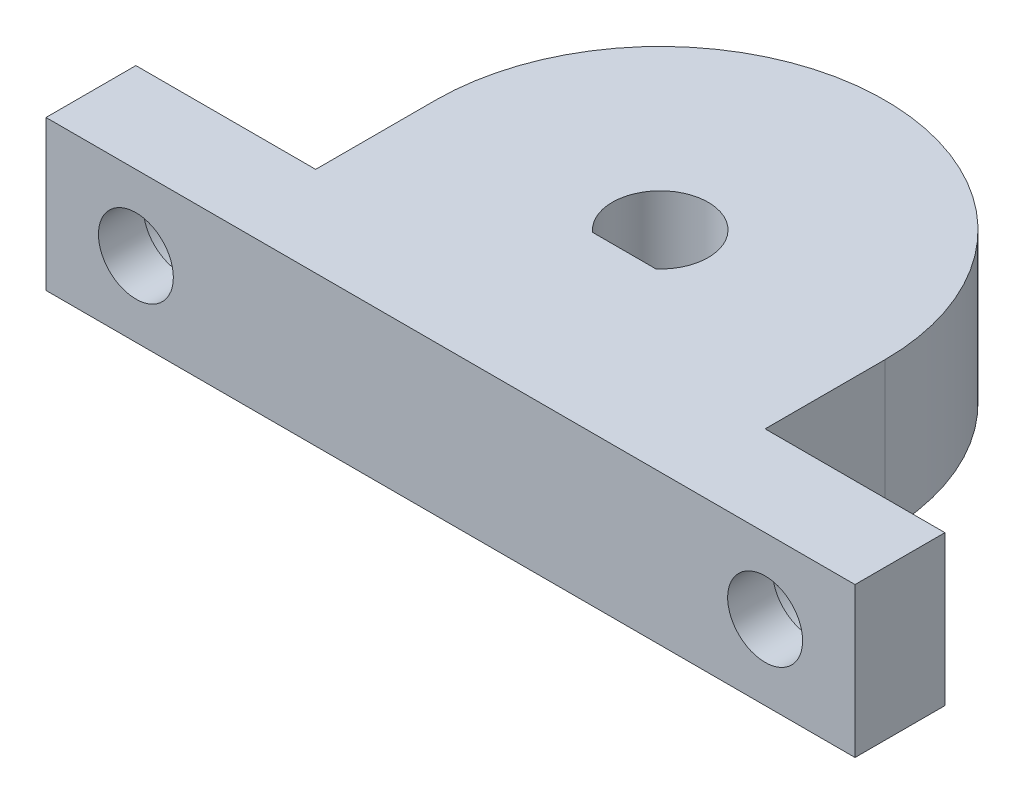
ISO-10303-21;
HEADER;
FILE_DESCRIPTION(('STEP AP214'),'2;1');
FILE_NAME('part.step','',(''),(''),'','','');
FILE_SCHEMA(('AUTOMOTIVE_DESIGN { 1 0 10303 214 1 1 1 1 }'));
ENDSEC;
DATA;
#1=APPLICATION_CONTEXT('core data for automotive mechanical design processes');
#2=APPLICATION_PROTOCOL_DEFINITION('international standard','automotive_design',2000,#1);
#3=PRODUCT_CONTEXT('',#1,'mechanical');
#4=PRODUCT('Part','Part','',(#3));
#5=PRODUCT_RELATED_PRODUCT_CATEGORY('part','',(#4));
#6=PRODUCT_DEFINITION_FORMATION('','',#4);
#7=PRODUCT_DEFINITION_CONTEXT('part definition',#1,'design');
#8=PRODUCT_DEFINITION('design','',#6,#7);
#9=PRODUCT_DEFINITION_SHAPE('','',#8);
#10=(LENGTH_UNIT() NAMED_UNIT(*) SI_UNIT(.MILLI.,.METRE.));
#11=(NAMED_UNIT(*) PLANE_ANGLE_UNIT() SI_UNIT($,.RADIAN.));
#12=(NAMED_UNIT(*) SI_UNIT($,.STERADIAN.) SOLID_ANGLE_UNIT());
#13=UNCERTAINTY_MEASURE_WITH_UNIT(LENGTH_MEASURE(1.E-05),#10,'distance_accuracy_value','');
#14=(GEOMETRIC_REPRESENTATION_CONTEXT(3) GLOBAL_UNCERTAINTY_ASSIGNED_CONTEXT((#13)) GLOBAL_UNIT_ASSIGNED_CONTEXT((#10,
#11,#12)) REPRESENTATION_CONTEXT('',''));
#15=CARTESIAN_POINT('',(0.,0.,0.));
#16=DIRECTION('',(0.,0.,1.));
#17=DIRECTION('',(1.,0.,0.));
#18=AXIS2_PLACEMENT_3D('',#15,#16,#17);
#19=CARTESIAN_POINT('',(152.500000000001,0.,0.));
#20=DIRECTION('',(-1.,0.,0.));
#21=DIRECTION('',(0.,0.,1.));
#22=AXIS2_PLACEMENT_3D('',#19,#20,#21);
#23=PLANE('',#22);
#24=DIRECTION('',(0.,0.,1.));
#25=VECTOR('',#24,1.);
#26=CARTESIAN_POINT('',(152.500000000001,0.,0.));
#27=LINE('',#26,#25);
#28=CARTESIAN_POINT('',(152.500000000001,0.,10.0000000000005));
#29=VERTEX_POINT('',#28);
#30=CARTESIAN_POINT('',(152.500000000001,0.,14.));
#31=VERTEX_POINT('',#30);
#32=EDGE_CURVE('E93',#29,#31,#27,.T.);
#33=ORIENTED_EDGE('',*,*,#32,.T.);
#34=DIRECTION('',(0.,1.,0.));
#35=VECTOR('',#34,1.);
#36=CARTESIAN_POINT('',(152.500000000001,0.,14.));
#37=LINE('',#36,#35);
#38=CARTESIAN_POINT('',(152.500000000001,5.,14.));
#39=VERTEX_POINT('',#38);
#40=EDGE_CURVE('E88',#31,#39,#37,.T.);
#41=ORIENTED_EDGE('',*,*,#40,.T.);
#42=DIRECTION('',(0.,0.,1.));
#43=VECTOR('',#42,1.);
#44=CARTESIAN_POINT('',(152.500000000001,5.,0.));
#45=LINE('',#44,#43);
#46=CARTESIAN_POINT('',(152.500000000001,5.,10.0000000000005));
#47=VERTEX_POINT('',#46);
#48=EDGE_CURVE('E207',#47,#39,#45,.T.);
#49=ORIENTED_EDGE('',*,*,#48,.F.);
#50=DIRECTION('',(0.,1.,0.));
#51=VECTOR('',#50,1.);
#52=CARTESIAN_POINT('',(152.500000000001,0.,10.0000000000005));
#53=LINE('',#52,#51);
#54=EDGE_CURVE('E203',#29,#47,#53,.T.);
#55=ORIENTED_EDGE('',*,*,#54,.F.);
#56=EDGE_LOOP('',(#33,#41,#49,#55));
#57=FACE_BOUND('',#56,.T.);
#58=ADVANCED_FACE('F71',(#57),#23,.T.);
#59=CARTESIAN_POINT('',(167.500000000001,0.,0.));
#60=DIRECTION('',(-1.,0.,0.));
#61=DIRECTION('',(0.,0.,1.));
#62=AXIS2_PLACEMENT_3D('',#59,#60,#61);
#63=PLANE('',#62);
#64=DIRECTION('',(0.,1.,0.));
#65=VECTOR('',#64,1.);
#66=CARTESIAN_POINT('',(167.500000000001,0.,14.));
#67=LINE('',#66,#65);
#68=CARTESIAN_POINT('',(167.500000000001,0.,14.));
#69=VERTEX_POINT('',#68);
#70=CARTESIAN_POINT('',(167.500000000001,5.,14.));
#71=VERTEX_POINT('',#70);
#72=EDGE_CURVE('E189',#69,#71,#67,.T.);
#73=ORIENTED_EDGE('',*,*,#72,.F.);
#74=DIRECTION('',(0.,0.,1.));
#75=VECTOR('',#74,1.);
#76=CARTESIAN_POINT('',(167.500000000001,0.,0.));
#77=LINE('',#76,#75);
#78=CARTESIAN_POINT('',(167.500000000001,0.,10.0000000000005));
#79=VERTEX_POINT('',#78);
#80=EDGE_CURVE('E200',#79,#69,#77,.T.);
#81=ORIENTED_EDGE('',*,*,#80,.F.);
#82=DIRECTION('',(0.,1.,0.));
#83=VECTOR('',#82,1.);
#84=CARTESIAN_POINT('',(167.500000000001,0.,10.0000000000005));
#85=LINE('',#84,#83);
#86=CARTESIAN_POINT('',(167.500000000001,5.,10.0000000000005));
#87=VERTEX_POINT('',#86);
#88=EDGE_CURVE('E204',#79,#87,#85,.T.);
#89=ORIENTED_EDGE('',*,*,#88,.T.);
#90=DIRECTION('',(0.,0.,1.));
#91=VECTOR('',#90,1.);
#92=CARTESIAN_POINT('',(167.500000000001,5.,0.));
#93=LINE('',#92,#91);
#94=EDGE_CURVE('E211',#87,#71,#93,.T.);
#95=ORIENTED_EDGE('',*,*,#94,.T.);
#96=EDGE_LOOP('',(#73,#81,#89,#95));
#97=FACE_BOUND('',#96,.T.);
#98=ADVANCED_FACE('F274',(#97),#63,.F.);
#99=CARTESIAN_POINT('',(160.,0.,10.));
#100=DIRECTION('',(0.,1.,0.));
#101=DIRECTION('',(0.,0.,1.));
#102=AXIS2_PLACEMENT_3D('',#99,#100,#101);
#103=CYLINDRICAL_SURFACE('',#102,1.59999999999999);
#104=CARTESIAN_POINT('',(160.,5.,10.));
#105=DIRECTION('',(0.,1.,0.));
#106=DIRECTION('',(0.,0.,1.));
#107=AXIS2_PLACEMENT_3D('',#104,#105,#106);
#108=CIRCLE('',#107,1.59999999999999);
#109=CARTESIAN_POINT('',(158.941699475574,5.,11.2));
#110=VERTEX_POINT('',#109);
#111=CARTESIAN_POINT('',(161.058300524426,5.,11.2));
#112=VERTEX_POINT('',#111);
#113=EDGE_CURVE('E80',#110,#112,#108,.F.);
#114=ORIENTED_EDGE('',*,*,#113,.F.);
#115=DIRECTION('',(0.,1.,0.));
#116=VECTOR('',#115,1.);
#117=CARTESIAN_POINT('',(158.941699475574,0.,11.2));
#118=LINE('',#117,#116);
#119=CARTESIAN_POINT('',(158.941699475574,0.,11.2));
#120=VERTEX_POINT('',#119);
#121=EDGE_CURVE('E225',#120,#110,#118,.T.);
#122=ORIENTED_EDGE('',*,*,#121,.F.);
#123=CARTESIAN_POINT('',(160.,0.,10.));
#124=DIRECTION('',(0.,1.,0.));
#125=DIRECTION('',(0.,0.,1.));
#126=AXIS2_PLACEMENT_3D('',#123,#124,#125);
#127=CIRCLE('',#126,1.59999999999999);
#128=CARTESIAN_POINT('',(161.058300524426,0.,11.2));
#129=VERTEX_POINT('',#128);
#130=EDGE_CURVE('E221',#129,#120,#127,.T.);
#131=ORIENTED_EDGE('',*,*,#130,.F.);
#132=DIRECTION('',(0.,1.,0.));
#133=VECTOR('',#132,1.);
#134=CARTESIAN_POINT('',(161.058300524426,0.,11.2));
#135=LINE('',#134,#133);
#136=EDGE_CURVE('E224',#129,#112,#135,.T.);
#137=ORIENTED_EDGE('',*,*,#136,.T.);
#138=EDGE_LOOP('',(#114,#122,#131,#137));
#139=FACE_BOUND('',#138,.T.);
#140=ADVANCED_FACE('F280',(#139),#103,.F.);
#141=CARTESIAN_POINT('',(0.,0.,11.2));
#142=DIRECTION('',(0.,0.,1.));
#143=DIRECTION('',(1.,0.,0.));
#144=AXIS2_PLACEMENT_3D('',#141,#142,#143);
#145=PLANE('',#144);
#146=DIRECTION('',(-1.,0.,0.));
#147=VECTOR('',#146,1.);
#148=CARTESIAN_POINT('',(0.,5.,11.2));
#149=LINE('',#148,#147);
#150=EDGE_CURVE('E216',#112,#110,#149,.T.);
#151=ORIENTED_EDGE('',*,*,#150,.F.);
#152=ORIENTED_EDGE('',*,*,#136,.F.);
#153=DIRECTION('',(1.,0.,0.));
#154=VECTOR('',#153,1.);
#155=CARTESIAN_POINT('',(0.,0.,11.2));
#156=LINE('',#155,#154);
#157=EDGE_CURVE('E218',#120,#129,#156,.T.);
#158=ORIENTED_EDGE('',*,*,#157,.F.);
#159=ORIENTED_EDGE('',*,*,#121,.T.);
#160=EDGE_LOOP('',(#151,#152,#158,#159));
#161=FACE_BOUND('',#160,.T.);
#162=ADVANCED_FACE('F289',(#161),#145,.F.);
#163=CARTESIAN_POINT('',(160.000000000001,0.,10.0000000000005));
#164=DIRECTION('',(0.,1.,0.));
#165=DIRECTION('',(0.,0.,1.));
#166=AXIS2_PLACEMENT_3D('',#163,#164,#165);
#167=CYLINDRICAL_SURFACE('',#166,7.50000000000001);
#168=ORIENTED_EDGE('',*,*,#88,.F.);
#169=CARTESIAN_POINT('',(160.000000000001,0.,10.0000000000005));
#170=DIRECTION('',(0.,1.,0.));
#171=DIRECTION('',(0.,0.,1.));
#172=AXIS2_PLACEMENT_3D('',#169,#170,#171);
#173=CIRCLE('',#172,7.50000000000001);
#174=EDGE_CURVE('E198',#79,#29,#173,.T.);
#175=ORIENTED_EDGE('',*,*,#174,.T.);
#176=ORIENTED_EDGE('',*,*,#54,.T.);
#177=CARTESIAN_POINT('',(160.000000000001,5.,10.0000000000005));
#178=DIRECTION('',(0.,1.,0.));
#179=DIRECTION('',(0.,0.,1.));
#180=AXIS2_PLACEMENT_3D('',#177,#178,#179);
#181=CIRCLE('',#180,7.50000000000001);
#182=EDGE_CURVE('E12',#87,#47,#181,.T.);
#183=ORIENTED_EDGE('',*,*,#182,.F.);
#184=EDGE_LOOP('',(#168,#175,#176,#183));
#185=FACE_BOUND('',#184,.T.);
#186=ADVANCED_FACE('F284',(#185),#167,.T.);
#187=CARTESIAN_POINT('',(140.,5.,0.));
#188=DIRECTION('',(0.,1.,0.));
#189=DIRECTION('',(0.,0.,1.));
#190=AXIS2_PLACEMENT_3D('',#187,#188,#189);
#191=PLANE('',#190);
#192=DIRECTION('',(1.,0.,0.));
#193=VECTOR('',#192,1.);
#194=CARTESIAN_POINT('',(140.,5.,17.));
#195=LINE('',#194,#193);
#196=CARTESIAN_POINT('',(146.500000000001,5.,17.));
#197=VERTEX_POINT('',#196);
#198=CARTESIAN_POINT('',(173.500000000001,5.,17.));
#199=VERTEX_POINT('',#198);
#200=EDGE_CURVE('E214',#197,#199,#195,.T.);
#201=ORIENTED_EDGE('',*,*,#200,.T.);
#202=DIRECTION('',(0.,0.,1.));
#203=VECTOR('',#202,1.);
#204=CARTESIAN_POINT('',(173.500000000001,5.,14.));
#205=LINE('',#204,#203);
#206=CARTESIAN_POINT('',(173.500000000001,5.,14.));
#207=VERTEX_POINT('',#206);
#208=EDGE_CURVE('E190',#207,#199,#205,.T.);
#209=ORIENTED_EDGE('',*,*,#208,.F.);
#210=DIRECTION('',(1.,0.,0.));
#211=VECTOR('',#210,1.);
#212=CARTESIAN_POINT('',(146.500000000001,5.,14.));
#213=LINE('',#212,#211);
#214=EDGE_CURVE('E185',#71,#207,#213,.T.);
#215=ORIENTED_EDGE('',*,*,#214,.F.);
#216=ORIENTED_EDGE('',*,*,#94,.F.);
#217=ORIENTED_EDGE('',*,*,#182,.T.);
#218=ORIENTED_EDGE('',*,*,#48,.T.);
#219=CARTESIAN_POINT('',(146.500000000001,5.,14.));
#220=VERTEX_POINT('',#219);
#221=EDGE_CURVE('E160',#220,#39,#213,.T.);
#222=ORIENTED_EDGE('',*,*,#221,.F.);
#223=DIRECTION('',(0.,0.,1.));
#224=VECTOR('',#223,1.);
#225=CARTESIAN_POINT('',(146.500000000001,5.,14.));
#226=LINE('',#225,#224);
#227=EDGE_CURVE('E172',#220,#197,#226,.T.);
#228=ORIENTED_EDGE('',*,*,#227,.T.);
#229=EDGE_LOOP('',(#201,#209,#215,#216,#217,#218,#222,#228));
#230=FACE_BOUND('',#229,.T.);
#231=ORIENTED_EDGE('',*,*,#150,.T.);
#232=ORIENTED_EDGE('',*,*,#113,.T.);
#233=EDGE_LOOP('',(#231,#232));
#234=FACE_BOUND('',#233,.T.);
#235=ADVANCED_FACE('F270',(#230,#234),#191,.T.);
#236=CARTESIAN_POINT('',(0.,0.,0.));
#237=DIRECTION('',(0.,1.,0.));
#238=DIRECTION('',(0.,0.,1.));
#239=AXIS2_PLACEMENT_3D('',#236,#237,#238);
#240=PLANE('',#239);
#241=DIRECTION('',(1.,0.,0.));
#242=VECTOR('',#241,1.);
#243=CARTESIAN_POINT('',(102.5,0.,17.));
#244=LINE('',#243,#242);
#245=CARTESIAN_POINT('',(146.500000000001,0.,17.));
#246=VERTEX_POINT('',#245);
#247=CARTESIAN_POINT('',(173.500000000001,0.,17.));
#248=VERTEX_POINT('',#247);
#249=EDGE_CURVE('E154',#246,#248,#244,.T.);
#250=ORIENTED_EDGE('',*,*,#249,.F.);
#251=DIRECTION('',(0.,0.,1.));
#252=VECTOR('',#251,1.);
#253=CARTESIAN_POINT('',(146.500000000001,0.,14.));
#254=LINE('',#253,#252);
#255=CARTESIAN_POINT('',(146.500000000001,0.,14.));
#256=VERTEX_POINT('',#255);
#257=EDGE_CURVE('E149',#256,#246,#254,.T.);
#258=ORIENTED_EDGE('',*,*,#257,.F.);
#259=DIRECTION('',(1.,0.,0.));
#260=VECTOR('',#259,1.);
#261=CARTESIAN_POINT('',(146.500000000001,0.,14.));
#262=LINE('',#261,#260);
#263=EDGE_CURVE('E152',#256,#31,#262,.T.);
#264=ORIENTED_EDGE('',*,*,#263,.T.);
#265=ORIENTED_EDGE('',*,*,#32,.F.);
#266=ORIENTED_EDGE('',*,*,#174,.F.);
#267=ORIENTED_EDGE('',*,*,#80,.T.);
#268=CARTESIAN_POINT('',(173.500000000001,0.,14.));
#269=VERTEX_POINT('',#268);
#270=EDGE_CURVE('E168',#69,#269,#262,.T.);
#271=ORIENTED_EDGE('',*,*,#270,.T.);
#272=DIRECTION('',(0.,0.,1.));
#273=VECTOR('',#272,1.);
#274=CARTESIAN_POINT('',(173.500000000001,0.,14.));
#275=LINE('',#274,#273);
#276=EDGE_CURVE('E159',#269,#248,#275,.T.);
#277=ORIENTED_EDGE('',*,*,#276,.T.);
#278=EDGE_LOOP('',(#250,#258,#264,#265,#266,#267,#271,#277));
#279=FACE_BOUND('',#278,.T.);
#280=ORIENTED_EDGE('',*,*,#130,.T.);
#281=ORIENTED_EDGE('',*,*,#157,.T.);
#282=EDGE_LOOP('',(#280,#281));
#283=FACE_BOUND('',#282,.T.);
#284=ADVANCED_FACE('F73',(#279,#283),#240,.F.);
#285=CARTESIAN_POINT('',(102.5,0.,17.));
#286=DIRECTION('',(0.,0.,1.));
#287=DIRECTION('',(1.,0.,0.));
#288=AXIS2_PLACEMENT_3D('',#285,#286,#287);
#289=PLANE('',#288);
#290=ORIENTED_EDGE('',*,*,#249,.T.);
#291=DIRECTION('',(0.,-1.,0.));
#292=VECTOR('',#291,1.);
#293=CARTESIAN_POINT('',(173.500000000001,5.,17.));
#294=LINE('',#293,#292);
#295=EDGE_CURVE('E174',#199,#248,#294,.T.);
#296=ORIENTED_EDGE('',*,*,#295,.F.);
#297=ORIENTED_EDGE('',*,*,#200,.F.);
#298=DIRECTION('',(0.,-1.,0.));
#299=VECTOR('',#298,1.);
#300=CARTESIAN_POINT('',(146.500000000001,5.,17.));
#301=LINE('',#300,#299);
#302=EDGE_CURVE('E177',#197,#246,#301,.T.);
#303=ORIENTED_EDGE('',*,*,#302,.T.);
#304=EDGE_LOOP('',(#290,#296,#297,#303));
#305=FACE_BOUND('',#304,.T.);
#306=CARTESIAN_POINT('',(170.500000000001,2.5,17.));
#307=DIRECTION('',(0.,0.,1.));
#308=DIRECTION('',(1.,0.,0.));
#309=AXIS2_PLACEMENT_3D('',#306,#307,#308);
#310=CIRCLE('',#309,1.25000000000001);
#311=CARTESIAN_POINT('',(171.750000000001,2.5,17.));
#312=VERTEX_POINT('',#311);
#313=EDGE_CURVE('E180',#312,#312,#310,.T.);
#314=ORIENTED_EDGE('',*,*,#313,.F.);
#315=EDGE_LOOP('',(#314));
#316=FACE_BOUND('',#315,.T.);
#317=CARTESIAN_POINT('',(149.500000000001,2.49999999999999,17.));
#318=DIRECTION('',(0.,0.,1.));
#319=DIRECTION('',(1.,0.,0.));
#320=AXIS2_PLACEMENT_3D('',#317,#318,#319);
#321=CIRCLE('',#320,1.25000000000001);
#322=CARTESIAN_POINT('',(150.750000000001,2.49999999999999,17.));
#323=VERTEX_POINT('',#322);
#324=EDGE_CURVE('E236',#323,#323,#321,.T.);
#325=ORIENTED_EDGE('',*,*,#324,.F.);
#326=EDGE_LOOP('',(#325));
#327=FACE_BOUND('',#326,.T.);
#328=ADVANCED_FACE('F258',(#305,#316,#327),#289,.T.);
#329=CARTESIAN_POINT('',(173.500000000001,5.,14.));
#330=DIRECTION('',(-1.,0.,0.));
#331=DIRECTION('',(0.,0.,1.));
#332=AXIS2_PLACEMENT_3D('',#329,#330,#331);
#333=PLANE('',#332);
#334=ORIENTED_EDGE('',*,*,#295,.T.);
#335=ORIENTED_EDGE('',*,*,#276,.F.);
#336=DIRECTION('',(0.,-1.,0.));
#337=VECTOR('',#336,1.);
#338=CARTESIAN_POINT('',(173.500000000001,5.,14.));
#339=LINE('',#338,#337);
#340=EDGE_CURVE('E167',#207,#269,#339,.T.);
#341=ORIENTED_EDGE('',*,*,#340,.F.);
#342=ORIENTED_EDGE('',*,*,#208,.T.);
#343=EDGE_LOOP('',(#334,#335,#341,#342));
#344=FACE_BOUND('',#343,.T.);
#345=ADVANCED_FACE('F261',(#344),#333,.F.);
#346=CARTESIAN_POINT('',(170.500000000001,2.5,14.));
#347=DIRECTION('',(0.,0.,1.));
#348=DIRECTION('',(1.,0.,0.));
#349=AXIS2_PLACEMENT_3D('',#346,#347,#348);
#350=CYLINDRICAL_SURFACE('',#349,1.25000000000001);
#351=CARTESIAN_POINT('',(170.500000000001,2.5,15.5));
#352=DIRECTION('',(0.,0.,1.));
#353=DIRECTION('',(1.,0.,0.));
#354=AXIS2_PLACEMENT_3D('',#351,#352,#353);
#355=CIRCLE('',#354,1.25000000000001);
#356=CARTESIAN_POINT('',(171.750000000001,2.5,15.5));
#357=VERTEX_POINT('',#356);
#358=EDGE_CURVE('E75',#357,#357,#355,.F.);
#359=ORIENTED_EDGE('',*,*,#358,.T.);
#360=EDGE_LOOP('',(#359));
#361=FACE_BOUND('',#360,.T.);
#362=ORIENTED_EDGE('',*,*,#313,.T.);
#363=EDGE_LOOP('',(#362));
#364=FACE_BOUND('',#363,.T.);
#365=ADVANCED_FACE('F256',(#361,#364),#350,.F.);
#366=CARTESIAN_POINT('',(0.,0.,14.));
#367=DIRECTION('',(0.,0.,1.));
#368=DIRECTION('',(1.,0.,0.));
#369=AXIS2_PLACEMENT_3D('',#366,#367,#368);
#370=PLANE('',#369);
#371=CARTESIAN_POINT('',(170.500000000001,2.5,14.));
#372=DIRECTION('',(0.,0.,1.));
#373=DIRECTION('',(1.,0.,0.));
#374=AXIS2_PLACEMENT_3D('',#371,#372,#373);
#375=CIRCLE('',#374,2.);
#376=CARTESIAN_POINT('',(172.500000000001,2.5,14.));
#377=VERTEX_POINT('',#376);
#378=EDGE_CURVE('E238',#377,#377,#375,.T.);
#379=ORIENTED_EDGE('',*,*,#378,.T.);
#380=EDGE_LOOP('',(#379));
#381=FACE_BOUND('',#380,.T.);
#382=ORIENTED_EDGE('',*,*,#270,.F.);
#383=ORIENTED_EDGE('',*,*,#72,.T.);
#384=ORIENTED_EDGE('',*,*,#214,.T.);
#385=ORIENTED_EDGE('',*,*,#340,.T.);
#386=EDGE_LOOP('',(#382,#383,#384,#385));
#387=FACE_BOUND('',#386,.T.);
#388=ADVANCED_FACE('F312',(#381,#387),#370,.F.);
#389=CARTESIAN_POINT('',(146.500000000001,5.,14.));
#390=DIRECTION('',(-1.,0.,0.));
#391=DIRECTION('',(0.,0.,1.));
#392=AXIS2_PLACEMENT_3D('',#389,#390,#391);
#393=PLANE('',#392);
#394=ORIENTED_EDGE('',*,*,#302,.F.);
#395=ORIENTED_EDGE('',*,*,#227,.F.);
#396=DIRECTION('',(0.,-1.,0.));
#397=VECTOR('',#396,1.);
#398=CARTESIAN_POINT('',(146.500000000001,5.,14.));
#399=LINE('',#398,#397);
#400=EDGE_CURVE('E166',#220,#256,#399,.T.);
#401=ORIENTED_EDGE('',*,*,#400,.T.);
#402=ORIENTED_EDGE('',*,*,#257,.T.);
#403=EDGE_LOOP('',(#394,#395,#401,#402));
#404=FACE_BOUND('',#403,.T.);
#405=ADVANCED_FACE('F170',(#404),#393,.T.);
#406=CARTESIAN_POINT('',(149.500000000001,2.49999999999999,14.));
#407=DIRECTION('',(0.,0.,1.));
#408=DIRECTION('',(1.,0.,0.));
#409=AXIS2_PLACEMENT_3D('',#406,#407,#408);
#410=CIRCLE('',#409,2.);
#411=CARTESIAN_POINT('',(151.500000000001,2.49999999999999,14.));
#412=VERTEX_POINT('',#411);
#413=EDGE_CURVE('E243',#412,#412,#410,.T.);
#414=ORIENTED_EDGE('',*,*,#413,.T.);
#415=EDGE_LOOP('',(#414));
#416=FACE_BOUND('',#415,.T.);
#417=ORIENTED_EDGE('',*,*,#40,.F.);
#418=ORIENTED_EDGE('',*,*,#263,.F.);
#419=ORIENTED_EDGE('',*,*,#400,.F.);
#420=ORIENTED_EDGE('',*,*,#221,.T.);
#421=EDGE_LOOP('',(#417,#418,#419,#420));
#422=FACE_BOUND('',#421,.T.);
#423=ADVANCED_FACE('F164',(#416,#422),#370,.F.);
#424=CARTESIAN_POINT('',(149.500000000001,2.49999999999999,14.));
#425=DIRECTION('',(0.,0.,1.));
#426=DIRECTION('',(1.,0.,0.));
#427=AXIS2_PLACEMENT_3D('',#424,#425,#426);
#428=CYLINDRICAL_SURFACE('',#427,1.25000000000001);
#429=CARTESIAN_POINT('',(149.500000000001,2.49999999999999,15.5));
#430=DIRECTION('',(0.,0.,1.));
#431=DIRECTION('',(1.,0.,0.));
#432=AXIS2_PLACEMENT_3D('',#429,#430,#431);
#433=CIRCLE('',#432,1.25000000000001);
#434=CARTESIAN_POINT('',(150.750000000001,2.49999999999999,15.5));
#435=VERTEX_POINT('',#434);
#436=EDGE_CURVE('E230',#435,#435,#433,.F.);
#437=ORIENTED_EDGE('',*,*,#436,.T.);
#438=EDGE_LOOP('',(#437));
#439=FACE_BOUND('',#438,.T.);
#440=ORIENTED_EDGE('',*,*,#324,.T.);
#441=EDGE_LOOP('',(#440));
#442=FACE_BOUND('',#441,.T.);
#443=ADVANCED_FACE('F326',(#439,#442),#428,.F.);
#444=CARTESIAN_POINT('',(149.500000000001,2.49999999999999,15.5));
#445=DIRECTION('',(0.,0.,1.));
#446=DIRECTION('',(1.,0.,0.));
#447=AXIS2_PLACEMENT_3D('',#444,#445,#446);
#448=PLANE('',#447);
#449=CARTESIAN_POINT('',(149.500000000001,2.49999999999999,15.5));
#450=DIRECTION('',(0.,0.,1.));
#451=DIRECTION('',(1.,0.,0.));
#452=AXIS2_PLACEMENT_3D('',#449,#450,#451);
#453=CIRCLE('',#452,2.);
#454=CARTESIAN_POINT('',(151.500000000001,2.49999999999999,15.5));
#455=VERTEX_POINT('',#454);
#456=EDGE_CURVE('E248',#455,#455,#453,.T.);
#457=ORIENTED_EDGE('',*,*,#456,.F.);
#458=EDGE_LOOP('',(#457));
#459=FACE_BOUND('',#458,.T.);
#460=ORIENTED_EDGE('',*,*,#436,.F.);
#461=EDGE_LOOP('',(#460));
#462=FACE_BOUND('',#461,.T.);
#463=ADVANCED_FACE('F331',(#459,#462),#448,.F.);
#464=CARTESIAN_POINT('',(149.500000000001,2.49999999999999,15.5));
#465=DIRECTION('',(0.,0.,-1.));
#466=DIRECTION('',(-1.,0.,0.));
#467=AXIS2_PLACEMENT_3D('',#464,#465,#466);
#468=CYLINDRICAL_SURFACE('',#467,2.);
#469=ORIENTED_EDGE('',*,*,#456,.T.);
#470=EDGE_LOOP('',(#469));
#471=FACE_BOUND('',#470,.T.);
#472=ORIENTED_EDGE('',*,*,#413,.F.);
#473=EDGE_LOOP('',(#472));
#474=FACE_BOUND('',#473,.T.);
#475=ADVANCED_FACE('F335',(#471,#474),#468,.F.);
#476=CARTESIAN_POINT('',(170.500000000001,2.5,15.5));
#477=DIRECTION('',(0.,0.,1.));
#478=DIRECTION('',(1.,0.,0.));
#479=AXIS2_PLACEMENT_3D('',#476,#477,#478);
#480=PLANE('',#479);
#481=CARTESIAN_POINT('',(170.500000000001,2.5,15.5));
#482=DIRECTION('',(0.,0.,1.));
#483=DIRECTION('',(1.,0.,0.));
#484=AXIS2_PLACEMENT_3D('',#481,#482,#483);
#485=CIRCLE('',#484,2.);
#486=CARTESIAN_POINT('',(172.500000000001,2.5,15.5));
#487=VERTEX_POINT('',#486);
#488=EDGE_CURVE('E232',#487,#487,#485,.T.);
#489=ORIENTED_EDGE('',*,*,#488,.F.);
#490=EDGE_LOOP('',(#489));
#491=FACE_BOUND('',#490,.T.);
#492=ORIENTED_EDGE('',*,*,#358,.F.);
#493=EDGE_LOOP('',(#492));
#494=FACE_BOUND('',#493,.T.);
#495=ADVANCED_FACE('F337',(#491,#494),#480,.F.);
#496=CARTESIAN_POINT('',(170.500000000001,2.5,15.5));
#497=DIRECTION('',(0.,0.,-1.));
#498=DIRECTION('',(-1.,0.,0.));
#499=AXIS2_PLACEMENT_3D('',#496,#497,#498);
#500=CYLINDRICAL_SURFACE('',#499,2.);
#501=ORIENTED_EDGE('',*,*,#488,.T.);
#502=EDGE_LOOP('',(#501));
#503=FACE_BOUND('',#502,.T.);
#504=ORIENTED_EDGE('',*,*,#378,.F.);
#505=EDGE_LOOP('',(#504));
#506=FACE_BOUND('',#505,.T.);
#507=ADVANCED_FACE('F344',(#503,#506),#500,.F.);
#508=CLOSED_SHELL('',(#58,#98,#140,#162,#186,#235,#284,#328,#345,#365,#388,#405,#423,#443,#463,
#475,#495,#507));
#509=MANIFOLD_SOLID_BREP('B2',#508);
#510=ADVANCED_BREP_SHAPE_REPRESENTATION('',(#18,#509),#14);
#511=SHAPE_DEFINITION_REPRESENTATION(#9,#510);
ENDSEC;
END-ISO-10303-21;
